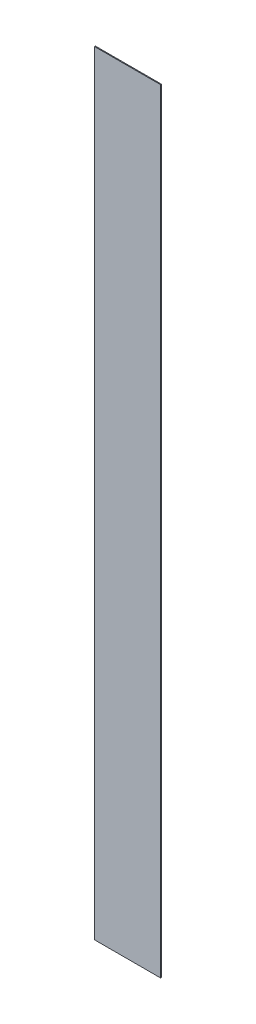
ISO-10303-21;
HEADER;
FILE_DESCRIPTION(('STEP AP214'),'2;1');
FILE_NAME('part.step','',(''),(''),'','','');
FILE_SCHEMA(('AUTOMOTIVE_DESIGN { 1 0 10303 214 1 1 1 1 }'));
ENDSEC;
DATA;
#1=APPLICATION_CONTEXT('core data for automotive mechanical design processes');
#2=APPLICATION_PROTOCOL_DEFINITION('international standard','automotive_design',2000,#1);
#3=PRODUCT_CONTEXT('',#1,'mechanical');
#4=PRODUCT('Part','Part','',(#3));
#5=PRODUCT_RELATED_PRODUCT_CATEGORY('part','',(#4));
#6=PRODUCT_DEFINITION_FORMATION('','',#4);
#7=PRODUCT_DEFINITION_CONTEXT('part definition',#1,'design');
#8=PRODUCT_DEFINITION('design','',#6,#7);
#9=PRODUCT_DEFINITION_SHAPE('','',#8);
#10=(LENGTH_UNIT() NAMED_UNIT(*) SI_UNIT(.MILLI.,.METRE.));
#11=(NAMED_UNIT(*) PLANE_ANGLE_UNIT() SI_UNIT($,.RADIAN.));
#12=(NAMED_UNIT(*) SI_UNIT($,.STERADIAN.) SOLID_ANGLE_UNIT());
#13=UNCERTAINTY_MEASURE_WITH_UNIT(LENGTH_MEASURE(1.E-05),#10,'distance_accuracy_value','');
#14=(GEOMETRIC_REPRESENTATION_CONTEXT(3) GLOBAL_UNCERTAINTY_ASSIGNED_CONTEXT((#13)) GLOBAL_UNIT_ASSIGNED_CONTEXT((#10,
#11,#12)) REPRESENTATION_CONTEXT('',''));
#15=CARTESIAN_POINT('',(0.,0.,0.));
#16=DIRECTION('',(0.,0.,1.));
#17=DIRECTION('',(1.,0.,0.));
#18=AXIS2_PLACEMENT_3D('',#15,#16,#17);
#19=CARTESIAN_POINT('',(150.,0.,2.));
#20=DIRECTION('',(0.,1.,0.));
#21=DIRECTION('',(0.,0.,1.));
#22=AXIS2_PLACEMENT_3D('',#19,#20,#21);
#23=PLANE('',#22);
#24=DIRECTION('',(1.,0.,0.));
#25=VECTOR('',#24,1.);
#26=CARTESIAN_POINT('',(150.,0.,0.));
#27=LINE('',#26,#25);
#28=CARTESIAN_POINT('',(0.,0.,0.));
#29=VERTEX_POINT('',#28);
#30=CARTESIAN_POINT('',(150.,0.,0.));
#31=VERTEX_POINT('',#30);
#32=EDGE_CURVE('E96',#29,#31,#27,.T.);
#33=ORIENTED_EDGE('',*,*,#32,.T.);
#34=DIRECTION('',(0.,0.,-1.));
#35=VECTOR('',#34,1.);
#36=CARTESIAN_POINT('',(150.,0.,2.));
#37=LINE('',#36,#35);
#38=CARTESIAN_POINT('',(150.,0.,2.));
#39=VERTEX_POINT('',#38);
#40=EDGE_CURVE('E11',#39,#31,#37,.T.);
#41=ORIENTED_EDGE('',*,*,#40,.F.);
#42=DIRECTION('',(1.,0.,0.));
#43=VECTOR('',#42,1.);
#44=CARTESIAN_POINT('',(150.,0.,2.));
#45=LINE('',#44,#43);
#46=CARTESIAN_POINT('',(0.,0.,2.));
#47=VERTEX_POINT('',#46);
#48=EDGE_CURVE('E84',#47,#39,#45,.T.);
#49=ORIENTED_EDGE('',*,*,#48,.F.);
#50=DIRECTION('',(0.,0.,-1.));
#51=VECTOR('',#50,1.);
#52=CARTESIAN_POINT('',(0.,0.,2.));
#53=LINE('',#52,#51);
#54=EDGE_CURVE('E92',#47,#29,#53,.T.);
#55=ORIENTED_EDGE('',*,*,#54,.T.);
#56=EDGE_LOOP('',(#33,#41,#49,#55));
#57=FACE_BOUND('',#56,.T.);
#58=ADVANCED_FACE('F33',(#57),#23,.F.);
#59=CARTESIAN_POINT('',(150.,1754.,2.));
#60=DIRECTION('',(-1.,0.,0.));
#61=DIRECTION('',(0.,0.,1.));
#62=AXIS2_PLACEMENT_3D('',#59,#60,#61);
#63=PLANE('',#62);
#64=DIRECTION('',(0.,1.,0.));
#65=VECTOR('',#64,1.);
#66=CARTESIAN_POINT('',(150.,1754.,0.));
#67=LINE('',#66,#65);
#68=CARTESIAN_POINT('',(150.,1754.,0.));
#69=VERTEX_POINT('',#68);
#70=EDGE_CURVE('E88',#31,#69,#67,.T.);
#71=ORIENTED_EDGE('',*,*,#70,.T.);
#72=DIRECTION('',(0.,0.,-1.));
#73=VECTOR('',#72,1.);
#74=CARTESIAN_POINT('',(150.,1754.,2.));
#75=LINE('',#74,#73);
#76=CARTESIAN_POINT('',(150.,1754.,2.));
#77=VERTEX_POINT('',#76);
#78=EDGE_CURVE('E41',#77,#69,#75,.T.);
#79=ORIENTED_EDGE('',*,*,#78,.F.);
#80=DIRECTION('',(0.,1.,0.));
#81=VECTOR('',#80,1.);
#82=CARTESIAN_POINT('',(150.,1754.,2.));
#83=LINE('',#82,#81);
#84=EDGE_CURVE('E79',#39,#77,#83,.T.);
#85=ORIENTED_EDGE('',*,*,#84,.F.);
#86=ORIENTED_EDGE('',*,*,#40,.T.);
#87=EDGE_LOOP('',(#71,#79,#85,#86));
#88=FACE_BOUND('',#87,.T.);
#89=ADVANCED_FACE('F87',(#88),#63,.F.);
#90=CARTESIAN_POINT('',(0.,1754.,2.));
#91=DIRECTION('',(0.,-1.,0.));
#92=DIRECTION('',(0.,0.,-1.));
#93=AXIS2_PLACEMENT_3D('',#90,#91,#92);
#94=PLANE('',#93);
#95=DIRECTION('',(-1.,0.,0.));
#96=VECTOR('',#95,1.);
#97=CARTESIAN_POINT('',(0.,1754.,0.));
#98=LINE('',#97,#96);
#99=CARTESIAN_POINT('',(0.,1754.,0.));
#100=VERTEX_POINT('',#99);
#101=EDGE_CURVE('E66',#69,#100,#98,.T.);
#102=ORIENTED_EDGE('',*,*,#101,.T.);
#103=DIRECTION('',(0.,0.,-1.));
#104=VECTOR('',#103,1.);
#105=CARTESIAN_POINT('',(0.,1754.,2.));
#106=LINE('',#105,#104);
#107=CARTESIAN_POINT('',(0.,1754.,2.));
#108=VERTEX_POINT('',#107);
#109=EDGE_CURVE('E89',#108,#100,#106,.T.);
#110=ORIENTED_EDGE('',*,*,#109,.F.);
#111=DIRECTION('',(-1.,0.,0.));
#112=VECTOR('',#111,1.);
#113=CARTESIAN_POINT('',(0.,1754.,2.));
#114=LINE('',#113,#112);
#115=EDGE_CURVE('E82',#77,#108,#114,.T.);
#116=ORIENTED_EDGE('',*,*,#115,.F.);
#117=ORIENTED_EDGE('',*,*,#78,.T.);
#118=EDGE_LOOP('',(#102,#110,#116,#117));
#119=FACE_BOUND('',#118,.T.);
#120=ADVANCED_FACE('F90',(#119),#94,.F.);
#121=CARTESIAN_POINT('',(0.,0.,2.));
#122=DIRECTION('',(1.,0.,0.));
#123=DIRECTION('',(0.,0.,-1.));
#124=AXIS2_PLACEMENT_3D('',#121,#122,#123);
#125=PLANE('',#124);
#126=DIRECTION('',(0.,-1.,0.));
#127=VECTOR('',#126,1.);
#128=CARTESIAN_POINT('',(0.,0.,0.));
#129=LINE('',#128,#127);
#130=EDGE_CURVE('E72',#100,#29,#129,.T.);
#131=ORIENTED_EDGE('',*,*,#130,.T.);
#132=ORIENTED_EDGE('',*,*,#54,.F.);
#133=DIRECTION('',(0.,-1.,0.));
#134=VECTOR('',#133,1.);
#135=CARTESIAN_POINT('',(0.,0.,2.));
#136=LINE('',#135,#134);
#137=EDGE_CURVE('E49',#108,#47,#136,.T.);
#138=ORIENTED_EDGE('',*,*,#137,.F.);
#139=ORIENTED_EDGE('',*,*,#109,.T.);
#140=EDGE_LOOP('',(#131,#132,#138,#139));
#141=FACE_BOUND('',#140,.T.);
#142=ADVANCED_FACE('F103',(#141),#125,.F.);
#143=CARTESIAN_POINT('',(0.,0.,2.));
#144=DIRECTION('',(0.,0.,-1.));
#145=DIRECTION('',(-1.,0.,0.));
#146=AXIS2_PLACEMENT_3D('',#143,#144,#145);
#147=PLANE('',#146);
#148=ORIENTED_EDGE('',*,*,#48,.T.);
#149=ORIENTED_EDGE('',*,*,#84,.T.);
#150=ORIENTED_EDGE('',*,*,#115,.T.);
#151=ORIENTED_EDGE('',*,*,#137,.T.);
#152=EDGE_LOOP('',(#148,#149,#150,#151));
#153=FACE_BOUND('',#152,.T.);
#154=ADVANCED_FACE('F80',(#153),#147,.F.);
#155=CARTESIAN_POINT('',(0.,0.,0.));
#156=DIRECTION('',(0.,0.,-1.));
#157=DIRECTION('',(-1.,0.,0.));
#158=AXIS2_PLACEMENT_3D('',#155,#156,#157);
#159=PLANE('',#158);
#160=ORIENTED_EDGE('',*,*,#32,.F.);
#161=ORIENTED_EDGE('',*,*,#130,.F.);
#162=ORIENTED_EDGE('',*,*,#101,.F.);
#163=ORIENTED_EDGE('',*,*,#70,.F.);
#164=EDGE_LOOP('',(#160,#161,#162,#163));
#165=FACE_BOUND('',#164,.T.);
#166=ADVANCED_FACE('F106',(#165),#159,.T.);
#167=CLOSED_SHELL('',(#58,#89,#120,#142,#154,#166));
#168=MANIFOLD_SOLID_BREP('B2',#167);
#169=ADVANCED_BREP_SHAPE_REPRESENTATION('',(#18,#168),#14);
#170=SHAPE_DEFINITION_REPRESENTATION(#9,#169);
ENDSEC;
END-ISO-10303-21;
